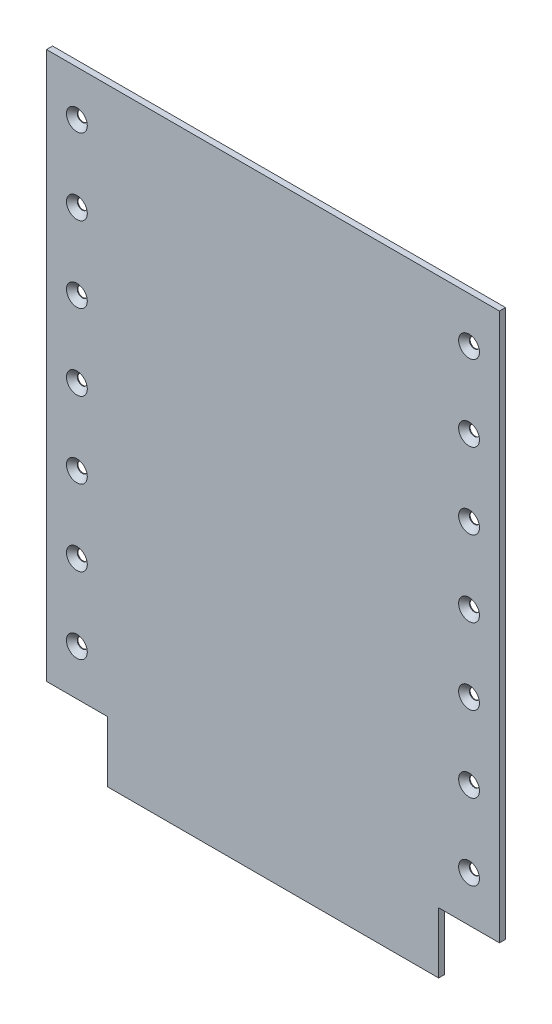
ISO-10303-21;
HEADER;
FILE_DESCRIPTION(('STEP AP214'),'2;1');
FILE_NAME('part.step','',(''),(''),'','','');
FILE_SCHEMA(('AUTOMOTIVE_DESIGN { 1 0 10303 214 1 1 1 1 }'));
ENDSEC;
DATA;
#1=APPLICATION_CONTEXT('core data for automotive mechanical design processes');
#2=APPLICATION_PROTOCOL_DEFINITION('international standard','automotive_design',2000,#1);
#3=PRODUCT_CONTEXT('',#1,'mechanical');
#4=PRODUCT('Part','Part','',(#3));
#5=PRODUCT_RELATED_PRODUCT_CATEGORY('part','',(#4));
#6=PRODUCT_DEFINITION_FORMATION('','',#4);
#7=PRODUCT_DEFINITION_CONTEXT('part definition',#1,'design');
#8=PRODUCT_DEFINITION('design','',#6,#7);
#9=PRODUCT_DEFINITION_SHAPE('','',#8);
#10=(LENGTH_UNIT() NAMED_UNIT(*) SI_UNIT(.MILLI.,.METRE.));
#11=(NAMED_UNIT(*) PLANE_ANGLE_UNIT() SI_UNIT($,.RADIAN.));
#12=(NAMED_UNIT(*) SI_UNIT($,.STERADIAN.) SOLID_ANGLE_UNIT());
#13=UNCERTAINTY_MEASURE_WITH_UNIT(LENGTH_MEASURE(1.E-05),#10,'distance_accuracy_value','');
#14=(GEOMETRIC_REPRESENTATION_CONTEXT(3) GLOBAL_UNCERTAINTY_ASSIGNED_CONTEXT((#13)) GLOBAL_UNIT_ASSIGNED_CONTEXT((#10,
#11,#12)) REPRESENTATION_CONTEXT('',''));
#15=CARTESIAN_POINT('',(0.,0.,0.));
#16=DIRECTION('',(0.,0.,1.));
#17=DIRECTION('',(1.,0.,0.));
#18=AXIS2_PLACEMENT_3D('',#15,#16,#17);
#19=CARTESIAN_POINT('',(0.,40.,4.));
#20=DIRECTION('',(1.,0.,0.));
#21=DIRECTION('',(0.,1.,0.));
#22=AXIS2_PLACEMENT_3D('',#19,#20,#21);
#23=PLANE('',#22);
#24=DIRECTION('',(0.,-1.,0.));
#25=VECTOR('',#24,1.);
#26=CARTESIAN_POINT('',(0.,40.,0.));
#27=LINE('',#26,#25);
#28=CARTESIAN_POINT('',(0.,40.,0.));
#29=VERTEX_POINT('',#28);
#30=CARTESIAN_POINT('',(0.,0.,0.));
#31=VERTEX_POINT('',#30);
#32=EDGE_CURVE('E129',#29,#31,#27,.T.);
#33=ORIENTED_EDGE('',*,*,#32,.T.);
#34=DIRECTION('',(0.,0.,-1.));
#35=VECTOR('',#34,1.);
#36=CARTESIAN_POINT('',(0.,0.,4.));
#37=LINE('',#36,#35);
#38=CARTESIAN_POINT('',(0.,0.,4.));
#39=VERTEX_POINT('',#38);
#40=EDGE_CURVE('E11',#39,#31,#37,.T.);
#41=ORIENTED_EDGE('',*,*,#40,.F.);
#42=DIRECTION('',(0.,-1.,0.));
#43=VECTOR('',#42,1.);
#44=CARTESIAN_POINT('',(0.,40.,4.));
#45=LINE('',#44,#43);
#46=CARTESIAN_POINT('',(0.,40.,4.));
#47=VERTEX_POINT('',#46);
#48=EDGE_CURVE('E145',#47,#39,#45,.T.);
#49=ORIENTED_EDGE('',*,*,#48,.F.);
#50=DIRECTION('',(0.,0.,-1.));
#51=VECTOR('',#50,1.);
#52=CARTESIAN_POINT('',(0.,40.,4.));
#53=LINE('',#52,#51);
#54=EDGE_CURVE('E125',#47,#29,#53,.T.);
#55=ORIENTED_EDGE('',*,*,#54,.T.);
#56=EDGE_LOOP('',(#33,#41,#49,#55));
#57=FACE_BOUND('',#56,.T.);
#58=ADVANCED_FACE('F34',(#57),#23,.F.);
#59=CARTESIAN_POINT('',(0.,0.,4.));
#60=DIRECTION('',(0.,1.,0.));
#61=DIRECTION('',(-1.,0.,0.));
#62=AXIS2_PLACEMENT_3D('',#59,#60,#61);
#63=PLANE('',#62);
#64=DIRECTION('',(1.,0.,0.));
#65=VECTOR('',#64,1.);
#66=CARTESIAN_POINT('',(0.,0.,0.));
#67=LINE('',#66,#65);
#68=CARTESIAN_POINT('',(218.,0.,0.));
#69=VERTEX_POINT('',#68);
#70=EDGE_CURVE('E132',#31,#69,#67,.T.);
#71=ORIENTED_EDGE('',*,*,#70,.T.);
#72=DIRECTION('',(0.,0.,-1.));
#73=VECTOR('',#72,1.);
#74=CARTESIAN_POINT('',(218.,0.,4.));
#75=LINE('',#74,#73);
#76=CARTESIAN_POINT('',(218.,0.,4.));
#77=VERTEX_POINT('',#76);
#78=EDGE_CURVE('E42',#77,#69,#75,.T.);
#79=ORIENTED_EDGE('',*,*,#78,.F.);
#80=DIRECTION('',(1.,0.,0.));
#81=VECTOR('',#80,1.);
#82=CARTESIAN_POINT('',(0.,0.,4.));
#83=LINE('',#82,#81);
#84=EDGE_CURVE('E93',#39,#77,#83,.T.);
#85=ORIENTED_EDGE('',*,*,#84,.F.);
#86=ORIENTED_EDGE('',*,*,#40,.T.);
#87=EDGE_LOOP('',(#71,#79,#85,#86));
#88=FACE_BOUND('',#87,.T.);
#89=ADVANCED_FACE('F353',(#88),#63,.F.);
#90=CARTESIAN_POINT('',(218.,40.,4.));
#91=DIRECTION('',(-1.,0.,0.));
#92=DIRECTION('',(0.,0.,1.));
#93=AXIS2_PLACEMENT_3D('',#90,#91,#92);
#94=PLANE('',#93);
#95=DIRECTION('',(0.,1.,0.));
#96=VECTOR('',#95,1.);
#97=CARTESIAN_POINT('',(218.,40.,0.));
#98=LINE('',#97,#96);
#99=CARTESIAN_POINT('',(218.,40.,0.));
#100=VERTEX_POINT('',#99);
#101=EDGE_CURVE('E135',#69,#100,#98,.T.);
#102=ORIENTED_EDGE('',*,*,#101,.T.);
#103=DIRECTION('',(0.,0.,-1.));
#104=VECTOR('',#103,1.);
#105=CARTESIAN_POINT('',(218.,40.,4.));
#106=LINE('',#105,#104);
#107=CARTESIAN_POINT('',(218.,40.,4.));
#108=VERTEX_POINT('',#107);
#109=EDGE_CURVE('E152',#108,#100,#106,.T.);
#110=ORIENTED_EDGE('',*,*,#109,.F.);
#111=DIRECTION('',(0.,1.,0.));
#112=VECTOR('',#111,1.);
#113=CARTESIAN_POINT('',(218.,40.,4.));
#114=LINE('',#113,#112);
#115=EDGE_CURVE('E160',#77,#108,#114,.T.);
#116=ORIENTED_EDGE('',*,*,#115,.F.);
#117=ORIENTED_EDGE('',*,*,#78,.T.);
#118=EDGE_LOOP('',(#102,#110,#116,#117));
#119=FACE_BOUND('',#118,.T.);
#120=ADVANCED_FACE('F158',(#119),#94,.F.);
#121=CARTESIAN_POINT('',(258.,40.,4.));
#122=DIRECTION('',(0.,1.,0.));
#123=DIRECTION('',(-1.,0.,0.));
#124=AXIS2_PLACEMENT_3D('',#121,#122,#123);
#125=PLANE('',#124);
#126=DIRECTION('',(1.,0.,0.));
#127=VECTOR('',#126,1.);
#128=CARTESIAN_POINT('',(258.,40.,0.));
#129=LINE('',#128,#127);
#130=CARTESIAN_POINT('',(258.,40.,0.));
#131=VERTEX_POINT('',#130);
#132=EDGE_CURVE('E137',#100,#131,#129,.T.);
#133=ORIENTED_EDGE('',*,*,#132,.T.);
#134=DIRECTION('',(0.,0.,-1.));
#135=VECTOR('',#134,1.);
#136=CARTESIAN_POINT('',(258.,40.,4.));
#137=LINE('',#136,#135);
#138=CARTESIAN_POINT('',(258.,40.,4.));
#139=VERTEX_POINT('',#138);
#140=EDGE_CURVE('E149',#139,#131,#137,.T.);
#141=ORIENTED_EDGE('',*,*,#140,.F.);
#142=DIRECTION('',(1.,0.,0.));
#143=VECTOR('',#142,1.);
#144=CARTESIAN_POINT('',(258.,40.,4.));
#145=LINE('',#144,#143);
#146=EDGE_CURVE('E172',#108,#139,#145,.T.);
#147=ORIENTED_EDGE('',*,*,#146,.F.);
#148=ORIENTED_EDGE('',*,*,#109,.T.);
#149=EDGE_LOOP('',(#133,#141,#147,#148));
#150=FACE_BOUND('',#149,.T.);
#151=ADVANCED_FACE('F168',(#150),#125,.F.);
#152=CARTESIAN_POINT('',(258.,400.,4.));
#153=DIRECTION('',(-1.,0.,0.));
#154=DIRECTION('',(0.,-1.,0.));
#155=AXIS2_PLACEMENT_3D('',#152,#153,#154);
#156=PLANE('',#155);
#157=DIRECTION('',(0.,1.,0.));
#158=VECTOR('',#157,1.);
#159=CARTESIAN_POINT('',(258.,400.,0.));
#160=LINE('',#159,#158);
#161=CARTESIAN_POINT('',(258.,400.,0.));
#162=VERTEX_POINT('',#161);
#163=EDGE_CURVE('E139',#131,#162,#160,.T.);
#164=ORIENTED_EDGE('',*,*,#163,.T.);
#165=DIRECTION('',(0.,0.,-1.));
#166=VECTOR('',#165,1.);
#167=CARTESIAN_POINT('',(258.,400.,4.));
#168=LINE('',#167,#166);
#169=CARTESIAN_POINT('',(258.,400.,4.));
#170=VERTEX_POINT('',#169);
#171=EDGE_CURVE('E120',#170,#162,#168,.T.);
#172=ORIENTED_EDGE('',*,*,#171,.F.);
#173=DIRECTION('',(0.,1.,0.));
#174=VECTOR('',#173,1.);
#175=CARTESIAN_POINT('',(258.,400.,4.));
#176=LINE('',#175,#174);
#177=EDGE_CURVE('E112',#139,#170,#176,.T.);
#178=ORIENTED_EDGE('',*,*,#177,.F.);
#179=ORIENTED_EDGE('',*,*,#140,.T.);
#180=EDGE_LOOP('',(#164,#172,#178,#179));
#181=FACE_BOUND('',#180,.T.);
#182=ADVANCED_FACE('F171',(#181),#156,.F.);
#183=CARTESIAN_POINT('',(0.,400.,4.));
#184=DIRECTION('',(0.,-1.,0.));
#185=DIRECTION('',(0.,0.,-1.));
#186=AXIS2_PLACEMENT_3D('',#183,#184,#185);
#187=PLANE('',#186);
#188=DIRECTION('',(-1.,0.,0.));
#189=VECTOR('',#188,1.);
#190=CARTESIAN_POINT('',(0.,400.,0.));
#191=LINE('',#190,#189);
#192=CARTESIAN_POINT('',(-40.,400.,0.));
#193=VERTEX_POINT('',#192);
#194=EDGE_CURVE('E119',#162,#193,#191,.T.);
#195=ORIENTED_EDGE('',*,*,#194,.T.);
#196=DIRECTION('',(0.,0.,-1.));
#197=VECTOR('',#196,1.);
#198=CARTESIAN_POINT('',(-40.,400.,4.));
#199=LINE('',#198,#197);
#200=CARTESIAN_POINT('',(-40.,400.,4.));
#201=VERTEX_POINT('',#200);
#202=EDGE_CURVE('E117',#201,#193,#199,.T.);
#203=ORIENTED_EDGE('',*,*,#202,.F.);
#204=DIRECTION('',(-1.,0.,0.));
#205=VECTOR('',#204,1.);
#206=CARTESIAN_POINT('',(218.,400.,4.));
#207=LINE('',#206,#205);
#208=EDGE_CURVE('E106',#170,#201,#207,.T.);
#209=ORIENTED_EDGE('',*,*,#208,.F.);
#210=ORIENTED_EDGE('',*,*,#171,.T.);
#211=EDGE_LOOP('',(#195,#203,#209,#210));
#212=FACE_BOUND('',#211,.T.);
#213=ADVANCED_FACE('F118',(#212),#187,.F.);
#214=CARTESIAN_POINT('',(-40.,400.,4.));
#215=DIRECTION('',(1.,0.,0.));
#216=DIRECTION('',(0.,1.,0.));
#217=AXIS2_PLACEMENT_3D('',#214,#215,#216);
#218=PLANE('',#217);
#219=DIRECTION('',(0.,-1.,0.));
#220=VECTOR('',#219,1.);
#221=CARTESIAN_POINT('',(-40.,400.,0.));
#222=LINE('',#221,#220);
#223=CARTESIAN_POINT('',(-40.,40.,0.));
#224=VERTEX_POINT('',#223);
#225=EDGE_CURVE('E79',#193,#224,#222,.T.);
#226=ORIENTED_EDGE('',*,*,#225,.T.);
#227=DIRECTION('',(0.,0.,-1.));
#228=VECTOR('',#227,1.);
#229=CARTESIAN_POINT('',(-40.,40.,4.));
#230=LINE('',#229,#228);
#231=CARTESIAN_POINT('',(-40.,40.,4.));
#232=VERTEX_POINT('',#231);
#233=EDGE_CURVE('E121',#232,#224,#230,.T.);
#234=ORIENTED_EDGE('',*,*,#233,.F.);
#235=DIRECTION('',(0.,-1.,0.));
#236=VECTOR('',#235,1.);
#237=CARTESIAN_POINT('',(-40.,400.,4.));
#238=LINE('',#237,#236);
#239=EDGE_CURVE('E110',#201,#232,#238,.T.);
#240=ORIENTED_EDGE('',*,*,#239,.F.);
#241=ORIENTED_EDGE('',*,*,#202,.T.);
#242=EDGE_LOOP('',(#226,#234,#240,#241));
#243=FACE_BOUND('',#242,.T.);
#244=ADVANCED_FACE('F123',(#243),#218,.F.);
#245=CARTESIAN_POINT('',(-40.,40.,4.));
#246=DIRECTION('',(0.,1.,0.));
#247=DIRECTION('',(0.,0.,1.));
#248=AXIS2_PLACEMENT_3D('',#245,#246,#247);
#249=PLANE('',#248);
#250=DIRECTION('',(1.,0.,0.));
#251=VECTOR('',#250,1.);
#252=CARTESIAN_POINT('',(-40.,40.,0.));
#253=LINE('',#252,#251);
#254=EDGE_CURVE('E85',#224,#29,#253,.T.);
#255=ORIENTED_EDGE('',*,*,#254,.T.);
#256=ORIENTED_EDGE('',*,*,#54,.F.);
#257=DIRECTION('',(1.,0.,0.));
#258=VECTOR('',#257,1.);
#259=CARTESIAN_POINT('',(-40.,40.,4.));
#260=LINE('',#259,#258);
#261=EDGE_CURVE('E50',#232,#47,#260,.T.);
#262=ORIENTED_EDGE('',*,*,#261,.F.);
#263=ORIENTED_EDGE('',*,*,#233,.T.);
#264=EDGE_LOOP('',(#255,#256,#262,#263));
#265=FACE_BOUND('',#264,.T.);
#266=ADVANCED_FACE('F308',(#265),#249,.F.);
#267=CARTESIAN_POINT('',(0.,0.,4.));
#268=DIRECTION('',(0.,0.,1.));
#269=DIRECTION('',(1.,0.,0.));
#270=AXIS2_PLACEMENT_3D('',#267,#268,#269);
#271=PLANE('',#270);
#272=CARTESIAN_POINT('',(238.,70.0000000000001,4.));
#273=DIRECTION('',(0.,0.,1.));
#274=DIRECTION('',(1.,0.,0.));
#275=AXIS2_PLACEMENT_3D('',#272,#273,#274);
#276=CIRCLE('',#275,6.855);
#277=CARTESIAN_POINT('',(244.855,70.0000000000001,4.));
#278=VERTEX_POINT('',#277);
#279=EDGE_CURVE('E300',#278,#278,#276,.T.);
#280=ORIENTED_EDGE('',*,*,#279,.F.);
#281=EDGE_LOOP('',(#280));
#282=FACE_BOUND('',#281,.T.);
#283=CARTESIAN_POINT('',(-20.,70.0000000000001,4.));
#284=DIRECTION('',(0.,0.,1.));
#285=DIRECTION('',(1.,0.,0.));
#286=AXIS2_PLACEMENT_3D('',#283,#284,#285);
#287=CIRCLE('',#286,6.855);
#288=CARTESIAN_POINT('',(-13.145,70.0000000000001,4.));
#289=VERTEX_POINT('',#288);
#290=EDGE_CURVE('E291',#289,#289,#287,.T.);
#291=ORIENTED_EDGE('',*,*,#290,.F.);
#292=EDGE_LOOP('',(#291));
#293=FACE_BOUND('',#292,.T.);
#294=CARTESIAN_POINT('',(238.,120.,4.));
#295=DIRECTION('',(0.,0.,1.));
#296=DIRECTION('',(1.,0.,0.));
#297=AXIS2_PLACEMENT_3D('',#294,#295,#296);
#298=CIRCLE('',#297,6.855);
#299=CARTESIAN_POINT('',(244.855,120.,4.));
#300=VERTEX_POINT('',#299);
#301=EDGE_CURVE('E282',#300,#300,#298,.T.);
#302=ORIENTED_EDGE('',*,*,#301,.F.);
#303=EDGE_LOOP('',(#302));
#304=FACE_BOUND('',#303,.T.);
#305=CARTESIAN_POINT('',(-20.0000000000002,120.,4.));
#306=DIRECTION('',(0.,0.,1.));
#307=DIRECTION('',(1.,0.,0.));
#308=AXIS2_PLACEMENT_3D('',#305,#306,#307);
#309=CIRCLE('',#308,6.855);
#310=CARTESIAN_POINT('',(-13.1450000000002,120.,4.));
#311=VERTEX_POINT('',#310);
#312=EDGE_CURVE('E273',#311,#311,#309,.T.);
#313=ORIENTED_EDGE('',*,*,#312,.F.);
#314=EDGE_LOOP('',(#313));
#315=FACE_BOUND('',#314,.T.);
#316=CARTESIAN_POINT('',(238.,170.,4.));
#317=DIRECTION('',(0.,0.,1.));
#318=DIRECTION('',(1.,0.,0.));
#319=AXIS2_PLACEMENT_3D('',#316,#317,#318);
#320=CIRCLE('',#319,6.855);
#321=CARTESIAN_POINT('',(244.855,170.,4.));
#322=VERTEX_POINT('',#321);
#323=EDGE_CURVE('E264',#322,#322,#320,.T.);
#324=ORIENTED_EDGE('',*,*,#323,.F.);
#325=EDGE_LOOP('',(#324));
#326=FACE_BOUND('',#325,.T.);
#327=CARTESIAN_POINT('',(-20.0000000000004,170.,4.));
#328=DIRECTION('',(0.,0.,1.));
#329=DIRECTION('',(1.,0.,0.));
#330=AXIS2_PLACEMENT_3D('',#327,#328,#329);
#331=CIRCLE('',#330,6.855);
#332=CARTESIAN_POINT('',(-13.1450000000004,170.,4.));
#333=VERTEX_POINT('',#332);
#334=EDGE_CURVE('E255',#333,#333,#331,.T.);
#335=ORIENTED_EDGE('',*,*,#334,.F.);
#336=EDGE_LOOP('',(#335));
#337=FACE_BOUND('',#336,.T.);
#338=CARTESIAN_POINT('',(238.,220.,4.));
#339=DIRECTION('',(0.,0.,1.));
#340=DIRECTION('',(1.,0.,0.));
#341=AXIS2_PLACEMENT_3D('',#338,#339,#340);
#342=CIRCLE('',#341,6.855);
#343=CARTESIAN_POINT('',(244.855,220.,4.));
#344=VERTEX_POINT('',#343);
#345=EDGE_CURVE('E246',#344,#344,#342,.T.);
#346=ORIENTED_EDGE('',*,*,#345,.F.);
#347=EDGE_LOOP('',(#346));
#348=FACE_BOUND('',#347,.T.);
#349=CARTESIAN_POINT('',(-20.0000000000006,220.,4.));
#350=DIRECTION('',(0.,0.,1.));
#351=DIRECTION('',(1.,0.,0.));
#352=AXIS2_PLACEMENT_3D('',#349,#350,#351);
#353=CIRCLE('',#352,6.855);
#354=CARTESIAN_POINT('',(-13.1450000000006,220.,4.));
#355=VERTEX_POINT('',#354);
#356=EDGE_CURVE('E237',#355,#355,#353,.T.);
#357=ORIENTED_EDGE('',*,*,#356,.F.);
#358=EDGE_LOOP('',(#357));
#359=FACE_BOUND('',#358,.T.);
#360=CARTESIAN_POINT('',(237.999999999999,270.,4.));
#361=DIRECTION('',(0.,0.,1.));
#362=DIRECTION('',(1.,0.,0.));
#363=AXIS2_PLACEMENT_3D('',#360,#361,#362);
#364=CIRCLE('',#363,6.855);
#365=CARTESIAN_POINT('',(244.854999999999,270.,4.));
#366=VERTEX_POINT('',#365);
#367=EDGE_CURVE('E228',#366,#366,#364,.T.);
#368=ORIENTED_EDGE('',*,*,#367,.F.);
#369=EDGE_LOOP('',(#368));
#370=FACE_BOUND('',#369,.T.);
#371=CARTESIAN_POINT('',(-20.0000000000008,270.,4.));
#372=DIRECTION('',(0.,0.,1.));
#373=DIRECTION('',(1.,0.,0.));
#374=AXIS2_PLACEMENT_3D('',#371,#372,#373);
#375=CIRCLE('',#374,6.855);
#376=CARTESIAN_POINT('',(-13.1450000000008,270.,4.));
#377=VERTEX_POINT('',#376);
#378=EDGE_CURVE('E219',#377,#377,#375,.T.);
#379=ORIENTED_EDGE('',*,*,#378,.F.);
#380=EDGE_LOOP('',(#379));
#381=FACE_BOUND('',#380,.T.);
#382=CARTESIAN_POINT('',(237.999999999999,320.,4.));
#383=DIRECTION('',(0.,0.,1.));
#384=DIRECTION('',(1.,0.,0.));
#385=AXIS2_PLACEMENT_3D('',#382,#383,#384);
#386=CIRCLE('',#385,6.855);
#387=CARTESIAN_POINT('',(244.854999999999,320.,4.));
#388=VERTEX_POINT('',#387);
#389=EDGE_CURVE('E210',#388,#388,#386,.T.);
#390=ORIENTED_EDGE('',*,*,#389,.F.);
#391=EDGE_LOOP('',(#390));
#392=FACE_BOUND('',#391,.T.);
#393=CARTESIAN_POINT('',(-20.0000000000009,320.,4.));
#394=DIRECTION('',(0.,0.,1.));
#395=DIRECTION('',(1.,0.,0.));
#396=AXIS2_PLACEMENT_3D('',#393,#394,#395);
#397=CIRCLE('',#396,6.855);
#398=CARTESIAN_POINT('',(-13.1450000000009,320.,4.));
#399=VERTEX_POINT('',#398);
#400=EDGE_CURVE('E201',#399,#399,#397,.T.);
#401=ORIENTED_EDGE('',*,*,#400,.F.);
#402=EDGE_LOOP('',(#401));
#403=FACE_BOUND('',#402,.T.);
#404=CARTESIAN_POINT('',(237.999999999999,370.,4.));
#405=DIRECTION('',(0.,0.,1.));
#406=DIRECTION('',(1.,0.,0.));
#407=AXIS2_PLACEMENT_3D('',#404,#405,#406);
#408=CIRCLE('',#407,6.855);
#409=CARTESIAN_POINT('',(244.854999999999,370.,4.));
#410=VERTEX_POINT('',#409);
#411=EDGE_CURVE('E192',#410,#410,#408,.T.);
#412=ORIENTED_EDGE('',*,*,#411,.F.);
#413=EDGE_LOOP('',(#412));
#414=FACE_BOUND('',#413,.T.);
#415=CARTESIAN_POINT('',(-20.0000000000011,370.,4.));
#416=DIRECTION('',(0.,0.,1.));
#417=DIRECTION('',(1.,0.,0.));
#418=AXIS2_PLACEMENT_3D('',#415,#416,#417);
#419=CIRCLE('',#418,6.855);
#420=CARTESIAN_POINT('',(-13.1450000000011,370.,4.));
#421=VERTEX_POINT('',#420);
#422=EDGE_CURVE('E183',#421,#421,#419,.T.);
#423=ORIENTED_EDGE('',*,*,#422,.F.);
#424=EDGE_LOOP('',(#423));
#425=FACE_BOUND('',#424,.T.);
#426=ORIENTED_EDGE('',*,*,#48,.T.);
#427=ORIENTED_EDGE('',*,*,#84,.T.);
#428=ORIENTED_EDGE('',*,*,#115,.T.);
#429=ORIENTED_EDGE('',*,*,#146,.T.);
#430=ORIENTED_EDGE('',*,*,#177,.T.);
#431=ORIENTED_EDGE('',*,*,#208,.T.);
#432=ORIENTED_EDGE('',*,*,#239,.T.);
#433=ORIENTED_EDGE('',*,*,#261,.T.);
#434=EDGE_LOOP('',(#426,#427,#428,#429,#430,#431,#432,#433));
#435=FACE_BOUND('',#434,.T.);
#436=ADVANCED_FACE('F108',(#282,#293,#304,#315,#326,#337,#348,#359,#370,#381,#392,#403,#414,
#425,#435),#271,.T.);
#437=CARTESIAN_POINT('',(0.,0.,0.));
#438=DIRECTION('',(0.,0.,1.));
#439=DIRECTION('',(1.,0.,0.));
#440=AXIS2_PLACEMENT_3D('',#437,#438,#439);
#441=PLANE('',#440);
#442=CARTESIAN_POINT('',(238.,70.0000000000001,0.));
#443=DIRECTION('',(0.,0.,1.));
#444=DIRECTION('',(1.,0.,0.));
#445=AXIS2_PLACEMENT_3D('',#442,#443,#444);
#446=CIRCLE('',#445,3.3);
#447=CARTESIAN_POINT('',(241.3,70.0000000000001,0.));
#448=VERTEX_POINT('',#447);
#449=EDGE_CURVE('E294',#448,#448,#446,.T.);
#450=ORIENTED_EDGE('',*,*,#449,.T.);
#451=EDGE_LOOP('',(#450));
#452=FACE_BOUND('',#451,.T.);
#453=CARTESIAN_POINT('',(-20.,70.0000000000001,0.));
#454=DIRECTION('',(0.,0.,1.));
#455=DIRECTION('',(1.,0.,0.));
#456=AXIS2_PLACEMENT_3D('',#453,#454,#455);
#457=CIRCLE('',#456,3.3);
#458=CARTESIAN_POINT('',(-16.7,70.0000000000001,0.));
#459=VERTEX_POINT('',#458);
#460=EDGE_CURVE('E285',#459,#459,#457,.T.);
#461=ORIENTED_EDGE('',*,*,#460,.T.);
#462=EDGE_LOOP('',(#461));
#463=FACE_BOUND('',#462,.T.);
#464=CARTESIAN_POINT('',(238.,120.,0.));
#465=DIRECTION('',(0.,0.,1.));
#466=DIRECTION('',(1.,0.,0.));
#467=AXIS2_PLACEMENT_3D('',#464,#465,#466);
#468=CIRCLE('',#467,3.3);
#469=CARTESIAN_POINT('',(241.3,120.,0.));
#470=VERTEX_POINT('',#469);
#471=EDGE_CURVE('E276',#470,#470,#468,.T.);
#472=ORIENTED_EDGE('',*,*,#471,.T.);
#473=EDGE_LOOP('',(#472));
#474=FACE_BOUND('',#473,.T.);
#475=CARTESIAN_POINT('',(-20.0000000000002,120.,0.));
#476=DIRECTION('',(0.,0.,1.));
#477=DIRECTION('',(1.,0.,0.));
#478=AXIS2_PLACEMENT_3D('',#475,#476,#477);
#479=CIRCLE('',#478,3.3);
#480=CARTESIAN_POINT('',(-16.7000000000002,120.,0.));
#481=VERTEX_POINT('',#480);
#482=EDGE_CURVE('E267',#481,#481,#479,.T.);
#483=ORIENTED_EDGE('',*,*,#482,.T.);
#484=EDGE_LOOP('',(#483));
#485=FACE_BOUND('',#484,.T.);
#486=CARTESIAN_POINT('',(238.,170.,0.));
#487=DIRECTION('',(0.,0.,1.));
#488=DIRECTION('',(1.,0.,0.));
#489=AXIS2_PLACEMENT_3D('',#486,#487,#488);
#490=CIRCLE('',#489,3.3);
#491=CARTESIAN_POINT('',(241.3,170.,0.));
#492=VERTEX_POINT('',#491);
#493=EDGE_CURVE('E258',#492,#492,#490,.T.);
#494=ORIENTED_EDGE('',*,*,#493,.T.);
#495=EDGE_LOOP('',(#494));
#496=FACE_BOUND('',#495,.T.);
#497=CARTESIAN_POINT('',(-20.0000000000004,170.,0.));
#498=DIRECTION('',(0.,0.,1.));
#499=DIRECTION('',(1.,0.,0.));
#500=AXIS2_PLACEMENT_3D('',#497,#498,#499);
#501=CIRCLE('',#500,3.3);
#502=CARTESIAN_POINT('',(-16.7000000000004,170.,0.));
#503=VERTEX_POINT('',#502);
#504=EDGE_CURVE('E249',#503,#503,#501,.T.);
#505=ORIENTED_EDGE('',*,*,#504,.T.);
#506=EDGE_LOOP('',(#505));
#507=FACE_BOUND('',#506,.T.);
#508=CARTESIAN_POINT('',(238.,220.,0.));
#509=DIRECTION('',(0.,0.,1.));
#510=DIRECTION('',(1.,0.,0.));
#511=AXIS2_PLACEMENT_3D('',#508,#509,#510);
#512=CIRCLE('',#511,3.3);
#513=CARTESIAN_POINT('',(241.3,220.,0.));
#514=VERTEX_POINT('',#513);
#515=EDGE_CURVE('E240',#514,#514,#512,.T.);
#516=ORIENTED_EDGE('',*,*,#515,.T.);
#517=EDGE_LOOP('',(#516));
#518=FACE_BOUND('',#517,.T.);
#519=CARTESIAN_POINT('',(-20.0000000000006,220.,0.));
#520=DIRECTION('',(0.,0.,1.));
#521=DIRECTION('',(1.,0.,0.));
#522=AXIS2_PLACEMENT_3D('',#519,#520,#521);
#523=CIRCLE('',#522,3.3);
#524=CARTESIAN_POINT('',(-16.7000000000006,220.,0.));
#525=VERTEX_POINT('',#524);
#526=EDGE_CURVE('E231',#525,#525,#523,.T.);
#527=ORIENTED_EDGE('',*,*,#526,.T.);
#528=EDGE_LOOP('',(#527));
#529=FACE_BOUND('',#528,.T.);
#530=CARTESIAN_POINT('',(237.999999999999,270.,0.));
#531=DIRECTION('',(0.,0.,1.));
#532=DIRECTION('',(1.,0.,0.));
#533=AXIS2_PLACEMENT_3D('',#530,#531,#532);
#534=CIRCLE('',#533,3.3);
#535=CARTESIAN_POINT('',(241.299999999999,270.,0.));
#536=VERTEX_POINT('',#535);
#537=EDGE_CURVE('E222',#536,#536,#534,.T.);
#538=ORIENTED_EDGE('',*,*,#537,.T.);
#539=EDGE_LOOP('',(#538));
#540=FACE_BOUND('',#539,.T.);
#541=CARTESIAN_POINT('',(-20.0000000000008,270.,0.));
#542=DIRECTION('',(0.,0.,1.));
#543=DIRECTION('',(1.,0.,0.));
#544=AXIS2_PLACEMENT_3D('',#541,#542,#543);
#545=CIRCLE('',#544,3.3);
#546=CARTESIAN_POINT('',(-16.7000000000008,270.,0.));
#547=VERTEX_POINT('',#546);
#548=EDGE_CURVE('E213',#547,#547,#545,.T.);
#549=ORIENTED_EDGE('',*,*,#548,.T.);
#550=EDGE_LOOP('',(#549));
#551=FACE_BOUND('',#550,.T.);
#552=CARTESIAN_POINT('',(237.999999999999,320.,0.));
#553=DIRECTION('',(0.,0.,1.));
#554=DIRECTION('',(1.,0.,0.));
#555=AXIS2_PLACEMENT_3D('',#552,#553,#554);
#556=CIRCLE('',#555,3.3);
#557=CARTESIAN_POINT('',(241.299999999999,320.,0.));
#558=VERTEX_POINT('',#557);
#559=EDGE_CURVE('E204',#558,#558,#556,.T.);
#560=ORIENTED_EDGE('',*,*,#559,.T.);
#561=EDGE_LOOP('',(#560));
#562=FACE_BOUND('',#561,.T.);
#563=CARTESIAN_POINT('',(-20.0000000000009,320.,0.));
#564=DIRECTION('',(0.,0.,1.));
#565=DIRECTION('',(1.,0.,0.));
#566=AXIS2_PLACEMENT_3D('',#563,#564,#565);
#567=CIRCLE('',#566,3.3);
#568=CARTESIAN_POINT('',(-16.7000000000009,320.,0.));
#569=VERTEX_POINT('',#568);
#570=EDGE_CURVE('E195',#569,#569,#567,.T.);
#571=ORIENTED_EDGE('',*,*,#570,.T.);
#572=EDGE_LOOP('',(#571));
#573=FACE_BOUND('',#572,.T.);
#574=CARTESIAN_POINT('',(237.999999999999,370.,0.));
#575=DIRECTION('',(0.,0.,1.));
#576=DIRECTION('',(1.,0.,0.));
#577=AXIS2_PLACEMENT_3D('',#574,#575,#576);
#578=CIRCLE('',#577,3.3);
#579=CARTESIAN_POINT('',(241.299999999999,370.,0.));
#580=VERTEX_POINT('',#579);
#581=EDGE_CURVE('E186',#580,#580,#578,.T.);
#582=ORIENTED_EDGE('',*,*,#581,.T.);
#583=EDGE_LOOP('',(#582));
#584=FACE_BOUND('',#583,.T.);
#585=CARTESIAN_POINT('',(-20.0000000000011,370.,0.));
#586=DIRECTION('',(0.,0.,1.));
#587=DIRECTION('',(1.,0.,0.));
#588=AXIS2_PLACEMENT_3D('',#585,#586,#587);
#589=CIRCLE('',#588,3.3);
#590=CARTESIAN_POINT('',(-16.7000000000011,370.,0.));
#591=VERTEX_POINT('',#590);
#592=EDGE_CURVE('E133',#591,#591,#589,.T.);
#593=ORIENTED_EDGE('',*,*,#592,.T.);
#594=EDGE_LOOP('',(#593));
#595=FACE_BOUND('',#594,.T.);
#596=ORIENTED_EDGE('',*,*,#32,.F.);
#597=ORIENTED_EDGE('',*,*,#254,.F.);
#598=ORIENTED_EDGE('',*,*,#225,.F.);
#599=ORIENTED_EDGE('',*,*,#194,.F.);
#600=ORIENTED_EDGE('',*,*,#163,.F.);
#601=ORIENTED_EDGE('',*,*,#132,.F.);
#602=ORIENTED_EDGE('',*,*,#101,.F.);
#603=ORIENTED_EDGE('',*,*,#70,.F.);
#604=EDGE_LOOP('',(#596,#597,#598,#599,#600,#601,#602,#603));
#605=FACE_BOUND('',#604,.T.);
#606=ADVANCED_FACE('F164',(#452,#463,#474,#485,#496,#507,#518,#529,#540,#551,#562,#573,#584,
#595,#605),#441,.F.);
#607=CARTESIAN_POINT('',(-20.0000000000011,370.,4.));
#608=DIRECTION('',(0.,0.,1.));
#609=DIRECTION('',(1.,0.,0.));
#610=AXIS2_PLACEMENT_3D('',#607,#608,#609);
#611=CYLINDRICAL_SURFACE('',#610,3.3);
#612=ORIENTED_EDGE('',*,*,#592,.F.);
#613=EDGE_LOOP('',(#612));
#614=FACE_BOUND('',#613,.T.);
#615=CARTESIAN_POINT('',(-20.0000000000011,370.,0.445000000000001));
#616=DIRECTION('',(0.,0.,1.));
#617=DIRECTION('',(1.,0.,0.));
#618=AXIS2_PLACEMENT_3D('',#615,#616,#617);
#619=CIRCLE('',#618,3.3);
#620=CARTESIAN_POINT('',(-16.7000000000011,370.,0.445000000000001));
#621=VERTEX_POINT('',#620);
#622=EDGE_CURVE('E180',#621,#621,#619,.T.);
#623=ORIENTED_EDGE('',*,*,#622,.T.);
#624=EDGE_LOOP('',(#623));
#625=FACE_BOUND('',#624,.T.);
#626=ADVANCED_FACE('F339',(#614,#625),#611,.F.);
#627=CARTESIAN_POINT('',(-20.0000000000011,370.,4.));
#628=DIRECTION('',(0.,0.,1.));
#629=DIRECTION('',(1.,0.,0.));
#630=AXIS2_PLACEMENT_3D('',#627,#628,#629);
#631=CONICAL_SURFACE('',#630,6.855,0.785398163397449);
#632=ORIENTED_EDGE('',*,*,#622,.F.);
#633=EDGE_LOOP('',(#632));
#634=FACE_BOUND('',#633,.T.);
#635=ORIENTED_EDGE('',*,*,#422,.T.);
#636=EDGE_LOOP('',(#635));
#637=FACE_BOUND('',#636,.T.);
#638=ADVANCED_FACE('F336',(#634,#637),#631,.F.);
#639=CARTESIAN_POINT('',(237.999999999999,370.,4.));
#640=DIRECTION('',(0.,0.,1.));
#641=DIRECTION('',(1.,0.,0.));
#642=AXIS2_PLACEMENT_3D('',#639,#640,#641);
#643=CYLINDRICAL_SURFACE('',#642,3.3);
#644=ORIENTED_EDGE('',*,*,#581,.F.);
#645=EDGE_LOOP('',(#644));
#646=FACE_BOUND('',#645,.T.);
#647=CARTESIAN_POINT('',(237.999999999999,370.,0.445000000000001));
#648=DIRECTION('',(0.,0.,1.));
#649=DIRECTION('',(1.,0.,0.));
#650=AXIS2_PLACEMENT_3D('',#647,#648,#649);
#651=CIRCLE('',#650,3.3);
#652=CARTESIAN_POINT('',(241.299999999999,370.,0.445000000000001));
#653=VERTEX_POINT('',#652);
#654=EDGE_CURVE('E189',#653,#653,#651,.T.);
#655=ORIENTED_EDGE('',*,*,#654,.T.);
#656=EDGE_LOOP('',(#655));
#657=FACE_BOUND('',#656,.T.);
#658=ADVANCED_FACE('F338',(#646,#657),#643,.F.);
#659=CARTESIAN_POINT('',(237.999999999999,370.,4.));
#660=DIRECTION('',(0.,0.,1.));
#661=DIRECTION('',(1.,0.,0.));
#662=AXIS2_PLACEMENT_3D('',#659,#660,#661);
#663=CONICAL_SURFACE('',#662,6.855,0.785398163397449);
#664=ORIENTED_EDGE('',*,*,#654,.F.);
#665=EDGE_LOOP('',(#664));
#666=FACE_BOUND('',#665,.T.);
#667=ORIENTED_EDGE('',*,*,#411,.T.);
#668=EDGE_LOOP('',(#667));
#669=FACE_BOUND('',#668,.T.);
#670=ADVANCED_FACE('F346',(#666,#669),#663,.F.);
#671=CARTESIAN_POINT('',(-20.0000000000009,320.,4.));
#672=DIRECTION('',(0.,0.,1.));
#673=DIRECTION('',(1.,0.,0.));
#674=AXIS2_PLACEMENT_3D('',#671,#672,#673);
#675=CYLINDRICAL_SURFACE('',#674,3.3);
#676=ORIENTED_EDGE('',*,*,#570,.F.);
#677=EDGE_LOOP('',(#676));
#678=FACE_BOUND('',#677,.T.);
#679=CARTESIAN_POINT('',(-20.0000000000009,320.,0.445000000000001));
#680=DIRECTION('',(0.,0.,1.));
#681=DIRECTION('',(1.,0.,0.));
#682=AXIS2_PLACEMENT_3D('',#679,#680,#681);
#683=CIRCLE('',#682,3.3);
#684=CARTESIAN_POINT('',(-16.7000000000009,320.,0.445000000000001));
#685=VERTEX_POINT('',#684);
#686=EDGE_CURVE('E198',#685,#685,#683,.T.);
#687=ORIENTED_EDGE('',*,*,#686,.T.);
#688=EDGE_LOOP('',(#687));
#689=FACE_BOUND('',#688,.T.);
#690=ADVANCED_FACE('F438',(#678,#689),#675,.F.);
#691=CARTESIAN_POINT('',(-20.0000000000009,320.,4.));
#692=DIRECTION('',(0.,0.,1.));
#693=DIRECTION('',(1.,0.,0.));
#694=AXIS2_PLACEMENT_3D('',#691,#692,#693);
#695=CONICAL_SURFACE('',#694,6.855,0.785398163397449);
#696=ORIENTED_EDGE('',*,*,#686,.F.);
#697=EDGE_LOOP('',(#696));
#698=FACE_BOUND('',#697,.T.);
#699=ORIENTED_EDGE('',*,*,#400,.T.);
#700=EDGE_LOOP('',(#699));
#701=FACE_BOUND('',#700,.T.);
#702=ADVANCED_FACE('F448',(#698,#701),#695,.F.);
#703=CARTESIAN_POINT('',(237.999999999999,320.,4.));
#704=DIRECTION('',(0.,0.,1.));
#705=DIRECTION('',(1.,0.,0.));
#706=AXIS2_PLACEMENT_3D('',#703,#704,#705);
#707=CYLINDRICAL_SURFACE('',#706,3.3);
#708=ORIENTED_EDGE('',*,*,#559,.F.);
#709=EDGE_LOOP('',(#708));
#710=FACE_BOUND('',#709,.T.);
#711=CARTESIAN_POINT('',(237.999999999999,320.,0.445000000000001));
#712=DIRECTION('',(0.,0.,1.));
#713=DIRECTION('',(1.,0.,0.));
#714=AXIS2_PLACEMENT_3D('',#711,#712,#713);
#715=CIRCLE('',#714,3.3);
#716=CARTESIAN_POINT('',(241.299999999999,320.,0.445000000000001));
#717=VERTEX_POINT('',#716);
#718=EDGE_CURVE('E207',#717,#717,#715,.T.);
#719=ORIENTED_EDGE('',*,*,#718,.T.);
#720=EDGE_LOOP('',(#719));
#721=FACE_BOUND('',#720,.T.);
#722=ADVANCED_FACE('F458',(#710,#721),#707,.F.);
#723=CARTESIAN_POINT('',(237.999999999999,320.,4.));
#724=DIRECTION('',(0.,0.,1.));
#725=DIRECTION('',(1.,0.,0.));
#726=AXIS2_PLACEMENT_3D('',#723,#724,#725);
#727=CONICAL_SURFACE('',#726,6.855,0.785398163397449);
#728=ORIENTED_EDGE('',*,*,#718,.F.);
#729=EDGE_LOOP('',(#728));
#730=FACE_BOUND('',#729,.T.);
#731=ORIENTED_EDGE('',*,*,#389,.T.);
#732=EDGE_LOOP('',(#731));
#733=FACE_BOUND('',#732,.T.);
#734=ADVANCED_FACE('F468',(#730,#733),#727,.F.);
#735=CARTESIAN_POINT('',(-20.0000000000008,270.,4.));
#736=DIRECTION('',(0.,0.,1.));
#737=DIRECTION('',(1.,0.,0.));
#738=AXIS2_PLACEMENT_3D('',#735,#736,#737);
#739=CYLINDRICAL_SURFACE('',#738,3.3);
#740=ORIENTED_EDGE('',*,*,#548,.F.);
#741=EDGE_LOOP('',(#740));
#742=FACE_BOUND('',#741,.T.);
#743=CARTESIAN_POINT('',(-20.0000000000008,270.,0.445000000000001));
#744=DIRECTION('',(0.,0.,1.));
#745=DIRECTION('',(1.,0.,0.));
#746=AXIS2_PLACEMENT_3D('',#743,#744,#745);
#747=CIRCLE('',#746,3.3);
#748=CARTESIAN_POINT('',(-16.7000000000008,270.,0.445000000000001));
#749=VERTEX_POINT('',#748);
#750=EDGE_CURVE('E216',#749,#749,#747,.T.);
#751=ORIENTED_EDGE('',*,*,#750,.T.);
#752=EDGE_LOOP('',(#751));
#753=FACE_BOUND('',#752,.T.);
#754=ADVANCED_FACE('F478',(#742,#753),#739,.F.);
#755=CARTESIAN_POINT('',(-20.0000000000008,270.,4.));
#756=DIRECTION('',(0.,0.,1.));
#757=DIRECTION('',(1.,0.,0.));
#758=AXIS2_PLACEMENT_3D('',#755,#756,#757);
#759=CONICAL_SURFACE('',#758,6.855,0.785398163397448);
#760=ORIENTED_EDGE('',*,*,#750,.F.);
#761=EDGE_LOOP('',(#760));
#762=FACE_BOUND('',#761,.T.);
#763=ORIENTED_EDGE('',*,*,#378,.T.);
#764=EDGE_LOOP('',(#763));
#765=FACE_BOUND('',#764,.T.);
#766=ADVANCED_FACE('F488',(#762,#765),#759,.F.);
#767=CARTESIAN_POINT('',(237.999999999999,270.,4.));
#768=DIRECTION('',(0.,0.,1.));
#769=DIRECTION('',(1.,0.,0.));
#770=AXIS2_PLACEMENT_3D('',#767,#768,#769);
#771=CYLINDRICAL_SURFACE('',#770,3.3);
#772=ORIENTED_EDGE('',*,*,#537,.F.);
#773=EDGE_LOOP('',(#772));
#774=FACE_BOUND('',#773,.T.);
#775=CARTESIAN_POINT('',(237.999999999999,270.,0.445000000000001));
#776=DIRECTION('',(0.,0.,1.));
#777=DIRECTION('',(1.,0.,0.));
#778=AXIS2_PLACEMENT_3D('',#775,#776,#777);
#779=CIRCLE('',#778,3.3);
#780=CARTESIAN_POINT('',(241.299999999999,270.,0.445000000000001));
#781=VERTEX_POINT('',#780);
#782=EDGE_CURVE('E225',#781,#781,#779,.T.);
#783=ORIENTED_EDGE('',*,*,#782,.T.);
#784=EDGE_LOOP('',(#783));
#785=FACE_BOUND('',#784,.T.);
#786=ADVANCED_FACE('F498',(#774,#785),#771,.F.);
#787=CARTESIAN_POINT('',(237.999999999999,270.,4.));
#788=DIRECTION('',(0.,0.,1.));
#789=DIRECTION('',(1.,0.,0.));
#790=AXIS2_PLACEMENT_3D('',#787,#788,#789);
#791=CONICAL_SURFACE('',#790,6.855,0.785398163397449);
#792=ORIENTED_EDGE('',*,*,#782,.F.);
#793=EDGE_LOOP('',(#792));
#794=FACE_BOUND('',#793,.T.);
#795=ORIENTED_EDGE('',*,*,#367,.T.);
#796=EDGE_LOOP('',(#795));
#797=FACE_BOUND('',#796,.T.);
#798=ADVANCED_FACE('F508',(#794,#797),#791,.F.);
#799=CARTESIAN_POINT('',(-20.0000000000006,220.,4.));
#800=DIRECTION('',(0.,0.,1.));
#801=DIRECTION('',(1.,0.,0.));
#802=AXIS2_PLACEMENT_3D('',#799,#800,#801);
#803=CYLINDRICAL_SURFACE('',#802,3.3);
#804=ORIENTED_EDGE('',*,*,#526,.F.);
#805=EDGE_LOOP('',(#804));
#806=FACE_BOUND('',#805,.T.);
#807=CARTESIAN_POINT('',(-20.0000000000006,220.,0.445000000000001));
#808=DIRECTION('',(0.,0.,1.));
#809=DIRECTION('',(1.,0.,0.));
#810=AXIS2_PLACEMENT_3D('',#807,#808,#809);
#811=CIRCLE('',#810,3.3);
#812=CARTESIAN_POINT('',(-16.7000000000006,220.,0.445000000000001));
#813=VERTEX_POINT('',#812);
#814=EDGE_CURVE('E234',#813,#813,#811,.T.);
#815=ORIENTED_EDGE('',*,*,#814,.T.);
#816=EDGE_LOOP('',(#815));
#817=FACE_BOUND('',#816,.T.);
#818=ADVANCED_FACE('F518',(#806,#817),#803,.F.);
#819=CARTESIAN_POINT('',(-20.0000000000006,220.,4.));
#820=DIRECTION('',(0.,0.,1.));
#821=DIRECTION('',(1.,0.,0.));
#822=AXIS2_PLACEMENT_3D('',#819,#820,#821);
#823=CONICAL_SURFACE('',#822,6.855,0.785398163397449);
#824=ORIENTED_EDGE('',*,*,#814,.F.);
#825=EDGE_LOOP('',(#824));
#826=FACE_BOUND('',#825,.T.);
#827=ORIENTED_EDGE('',*,*,#356,.T.);
#828=EDGE_LOOP('',(#827));
#829=FACE_BOUND('',#828,.T.);
#830=ADVANCED_FACE('F528',(#826,#829),#823,.F.);
#831=CARTESIAN_POINT('',(238.,220.,4.));
#832=DIRECTION('',(0.,0.,1.));
#833=DIRECTION('',(1.,0.,0.));
#834=AXIS2_PLACEMENT_3D('',#831,#832,#833);
#835=CYLINDRICAL_SURFACE('',#834,3.3);
#836=ORIENTED_EDGE('',*,*,#515,.F.);
#837=EDGE_LOOP('',(#836));
#838=FACE_BOUND('',#837,.T.);
#839=CARTESIAN_POINT('',(238.,220.,0.445000000000001));
#840=DIRECTION('',(0.,0.,1.));
#841=DIRECTION('',(1.,0.,0.));
#842=AXIS2_PLACEMENT_3D('',#839,#840,#841);
#843=CIRCLE('',#842,3.3);
#844=CARTESIAN_POINT('',(241.3,220.,0.445000000000001));
#845=VERTEX_POINT('',#844);
#846=EDGE_CURVE('E243',#845,#845,#843,.T.);
#847=ORIENTED_EDGE('',*,*,#846,.T.);
#848=EDGE_LOOP('',(#847));
#849=FACE_BOUND('',#848,.T.);
#850=ADVANCED_FACE('F538',(#838,#849),#835,.F.);
#851=CARTESIAN_POINT('',(238.,220.,4.));
#852=DIRECTION('',(0.,0.,1.));
#853=DIRECTION('',(1.,0.,0.));
#854=AXIS2_PLACEMENT_3D('',#851,#852,#853);
#855=CONICAL_SURFACE('',#854,6.855,0.785398163397449);
#856=ORIENTED_EDGE('',*,*,#846,.F.);
#857=EDGE_LOOP('',(#856));
#858=FACE_BOUND('',#857,.T.);
#859=ORIENTED_EDGE('',*,*,#345,.T.);
#860=EDGE_LOOP('',(#859));
#861=FACE_BOUND('',#860,.T.);
#862=ADVANCED_FACE('F548',(#858,#861),#855,.F.);
#863=CARTESIAN_POINT('',(-20.0000000000004,170.,4.));
#864=DIRECTION('',(0.,0.,1.));
#865=DIRECTION('',(1.,0.,0.));
#866=AXIS2_PLACEMENT_3D('',#863,#864,#865);
#867=CYLINDRICAL_SURFACE('',#866,3.3);
#868=ORIENTED_EDGE('',*,*,#504,.F.);
#869=EDGE_LOOP('',(#868));
#870=FACE_BOUND('',#869,.T.);
#871=CARTESIAN_POINT('',(-20.0000000000004,170.,0.445000000000001));
#872=DIRECTION('',(0.,0.,1.));
#873=DIRECTION('',(1.,0.,0.));
#874=AXIS2_PLACEMENT_3D('',#871,#872,#873);
#875=CIRCLE('',#874,3.3);
#876=CARTESIAN_POINT('',(-16.7000000000004,170.,0.445000000000001));
#877=VERTEX_POINT('',#876);
#878=EDGE_CURVE('E252',#877,#877,#875,.T.);
#879=ORIENTED_EDGE('',*,*,#878,.T.);
#880=EDGE_LOOP('',(#879));
#881=FACE_BOUND('',#880,.T.);
#882=ADVANCED_FACE('F558',(#870,#881),#867,.F.);
#883=CARTESIAN_POINT('',(-20.0000000000004,170.,4.));
#884=DIRECTION('',(0.,0.,1.));
#885=DIRECTION('',(1.,0.,0.));
#886=AXIS2_PLACEMENT_3D('',#883,#884,#885);
#887=CONICAL_SURFACE('',#886,6.855,0.785398163397448);
#888=ORIENTED_EDGE('',*,*,#878,.F.);
#889=EDGE_LOOP('',(#888));
#890=FACE_BOUND('',#889,.T.);
#891=ORIENTED_EDGE('',*,*,#334,.T.);
#892=EDGE_LOOP('',(#891));
#893=FACE_BOUND('',#892,.T.);
#894=ADVANCED_FACE('F568',(#890,#893),#887,.F.);
#895=CARTESIAN_POINT('',(238.,170.,4.));
#896=DIRECTION('',(0.,0.,1.));
#897=DIRECTION('',(1.,0.,0.));
#898=AXIS2_PLACEMENT_3D('',#895,#896,#897);
#899=CYLINDRICAL_SURFACE('',#898,3.3);
#900=ORIENTED_EDGE('',*,*,#493,.F.);
#901=EDGE_LOOP('',(#900));
#902=FACE_BOUND('',#901,.T.);
#903=CARTESIAN_POINT('',(238.,170.,0.445000000000001));
#904=DIRECTION('',(0.,0.,1.));
#905=DIRECTION('',(1.,0.,0.));
#906=AXIS2_PLACEMENT_3D('',#903,#904,#905);
#907=CIRCLE('',#906,3.3);
#908=CARTESIAN_POINT('',(241.3,170.,0.445000000000001));
#909=VERTEX_POINT('',#908);
#910=EDGE_CURVE('E261',#909,#909,#907,.T.);
#911=ORIENTED_EDGE('',*,*,#910,.T.);
#912=EDGE_LOOP('',(#911));
#913=FACE_BOUND('',#912,.T.);
#914=ADVANCED_FACE('F578',(#902,#913),#899,.F.);
#915=CARTESIAN_POINT('',(238.,170.,4.));
#916=DIRECTION('',(0.,0.,1.));
#917=DIRECTION('',(1.,0.,0.));
#918=AXIS2_PLACEMENT_3D('',#915,#916,#917);
#919=CONICAL_SURFACE('',#918,6.855,0.785398163397449);
#920=ORIENTED_EDGE('',*,*,#910,.F.);
#921=EDGE_LOOP('',(#920));
#922=FACE_BOUND('',#921,.T.);
#923=ORIENTED_EDGE('',*,*,#323,.T.);
#924=EDGE_LOOP('',(#923));
#925=FACE_BOUND('',#924,.T.);
#926=ADVANCED_FACE('F588',(#922,#925),#919,.F.);
#927=CARTESIAN_POINT('',(-20.0000000000002,120.,4.));
#928=DIRECTION('',(0.,0.,1.));
#929=DIRECTION('',(1.,0.,0.));
#930=AXIS2_PLACEMENT_3D('',#927,#928,#929);
#931=CYLINDRICAL_SURFACE('',#930,3.3);
#932=ORIENTED_EDGE('',*,*,#482,.F.);
#933=EDGE_LOOP('',(#932));
#934=FACE_BOUND('',#933,.T.);
#935=CARTESIAN_POINT('',(-20.0000000000002,120.,0.445000000000001));
#936=DIRECTION('',(0.,0.,1.));
#937=DIRECTION('',(1.,0.,0.));
#938=AXIS2_PLACEMENT_3D('',#935,#936,#937);
#939=CIRCLE('',#938,3.3);
#940=CARTESIAN_POINT('',(-16.7000000000002,120.,0.445000000000001));
#941=VERTEX_POINT('',#940);
#942=EDGE_CURVE('E270',#941,#941,#939,.T.);
#943=ORIENTED_EDGE('',*,*,#942,.T.);
#944=EDGE_LOOP('',(#943));
#945=FACE_BOUND('',#944,.T.);
#946=ADVANCED_FACE('F598',(#934,#945),#931,.F.);
#947=CARTESIAN_POINT('',(-20.0000000000002,120.,4.));
#948=DIRECTION('',(0.,0.,1.));
#949=DIRECTION('',(1.,0.,0.));
#950=AXIS2_PLACEMENT_3D('',#947,#948,#949);
#951=CONICAL_SURFACE('',#950,6.855,0.785398163397449);
#952=ORIENTED_EDGE('',*,*,#942,.F.);
#953=EDGE_LOOP('',(#952));
#954=FACE_BOUND('',#953,.T.);
#955=ORIENTED_EDGE('',*,*,#312,.T.);
#956=EDGE_LOOP('',(#955));
#957=FACE_BOUND('',#956,.T.);
#958=ADVANCED_FACE('F608',(#954,#957),#951,.F.);
#959=CARTESIAN_POINT('',(238.,120.,4.));
#960=DIRECTION('',(0.,0.,1.));
#961=DIRECTION('',(1.,0.,0.));
#962=AXIS2_PLACEMENT_3D('',#959,#960,#961);
#963=CYLINDRICAL_SURFACE('',#962,3.3);
#964=ORIENTED_EDGE('',*,*,#471,.F.);
#965=EDGE_LOOP('',(#964));
#966=FACE_BOUND('',#965,.T.);
#967=CARTESIAN_POINT('',(238.,120.,0.445000000000001));
#968=DIRECTION('',(0.,0.,1.));
#969=DIRECTION('',(1.,0.,0.));
#970=AXIS2_PLACEMENT_3D('',#967,#968,#969);
#971=CIRCLE('',#970,3.3);
#972=CARTESIAN_POINT('',(241.3,120.,0.445000000000001));
#973=VERTEX_POINT('',#972);
#974=EDGE_CURVE('E279',#973,#973,#971,.T.);
#975=ORIENTED_EDGE('',*,*,#974,.T.);
#976=EDGE_LOOP('',(#975));
#977=FACE_BOUND('',#976,.T.);
#978=ADVANCED_FACE('F618',(#966,#977),#963,.F.);
#979=CARTESIAN_POINT('',(238.,120.,4.));
#980=DIRECTION('',(0.,0.,1.));
#981=DIRECTION('',(1.,0.,0.));
#982=AXIS2_PLACEMENT_3D('',#979,#980,#981);
#983=CONICAL_SURFACE('',#982,6.855,0.785398163397449);
#984=ORIENTED_EDGE('',*,*,#974,.F.);
#985=EDGE_LOOP('',(#984));
#986=FACE_BOUND('',#985,.T.);
#987=ORIENTED_EDGE('',*,*,#301,.T.);
#988=EDGE_LOOP('',(#987));
#989=FACE_BOUND('',#988,.T.);
#990=ADVANCED_FACE('F628',(#986,#989),#983,.F.);
#991=CARTESIAN_POINT('',(-20.,70.0000000000001,4.));
#992=DIRECTION('',(0.,0.,1.));
#993=DIRECTION('',(1.,0.,0.));
#994=AXIS2_PLACEMENT_3D('',#991,#992,#993);
#995=CYLINDRICAL_SURFACE('',#994,3.3);
#996=ORIENTED_EDGE('',*,*,#460,.F.);
#997=EDGE_LOOP('',(#996));
#998=FACE_BOUND('',#997,.T.);
#999=CARTESIAN_POINT('',(-20.,70.0000000000001,0.445000000000001));
#1000=DIRECTION('',(0.,0.,1.));
#1001=DIRECTION('',(1.,0.,0.));
#1002=AXIS2_PLACEMENT_3D('',#999,#1000,#1001);
#1003=CIRCLE('',#1002,3.3);
#1004=CARTESIAN_POINT('',(-16.7,70.0000000000001,0.445000000000001));
#1005=VERTEX_POINT('',#1004);
#1006=EDGE_CURVE('E288',#1005,#1005,#1003,.T.);
#1007=ORIENTED_EDGE('',*,*,#1006,.T.);
#1008=EDGE_LOOP('',(#1007));
#1009=FACE_BOUND('',#1008,.T.);
#1010=ADVANCED_FACE('F638',(#998,#1009),#995,.F.);
#1011=CARTESIAN_POINT('',(-20.,70.0000000000001,4.));
#1012=DIRECTION('',(0.,0.,1.));
#1013=DIRECTION('',(1.,0.,0.));
#1014=AXIS2_PLACEMENT_3D('',#1011,#1012,#1013);
#1015=CONICAL_SURFACE('',#1014,6.855,0.785398163397448);
#1016=ORIENTED_EDGE('',*,*,#1006,.F.);
#1017=EDGE_LOOP('',(#1016));
#1018=FACE_BOUND('',#1017,.T.);
#1019=ORIENTED_EDGE('',*,*,#290,.T.);
#1020=EDGE_LOOP('',(#1019));
#1021=FACE_BOUND('',#1020,.T.);
#1022=ADVANCED_FACE('F648',(#1018,#1021),#1015,.F.);
#1023=CARTESIAN_POINT('',(238.,70.0000000000001,4.));
#1024=DIRECTION('',(0.,0.,1.));
#1025=DIRECTION('',(1.,0.,0.));
#1026=AXIS2_PLACEMENT_3D('',#1023,#1024,#1025);
#1027=CYLINDRICAL_SURFACE('',#1026,3.3);
#1028=ORIENTED_EDGE('',*,*,#449,.F.);
#1029=EDGE_LOOP('',(#1028));
#1030=FACE_BOUND('',#1029,.T.);
#1031=CARTESIAN_POINT('',(238.,70.0000000000001,0.445000000000001));
#1032=DIRECTION('',(0.,0.,1.));
#1033=DIRECTION('',(1.,0.,0.));
#1034=AXIS2_PLACEMENT_3D('',#1031,#1032,#1033);
#1035=CIRCLE('',#1034,3.3);
#1036=CARTESIAN_POINT('',(241.3,70.0000000000001,0.445000000000001));
#1037=VERTEX_POINT('',#1036);
#1038=EDGE_CURVE('E297',#1037,#1037,#1035,.T.);
#1039=ORIENTED_EDGE('',*,*,#1038,.T.);
#1040=EDGE_LOOP('',(#1039));
#1041=FACE_BOUND('',#1040,.T.);
#1042=ADVANCED_FACE('F658',(#1030,#1041),#1027,.F.);
#1043=CARTESIAN_POINT('',(238.,70.0000000000001,4.));
#1044=DIRECTION('',(0.,0.,1.));
#1045=DIRECTION('',(1.,0.,0.));
#1046=AXIS2_PLACEMENT_3D('',#1043,#1044,#1045);
#1047=CONICAL_SURFACE('',#1046,6.855,0.785398163397449);
#1048=ORIENTED_EDGE('',*,*,#1038,.F.);
#1049=EDGE_LOOP('',(#1048));
#1050=FACE_BOUND('',#1049,.T.);
#1051=ORIENTED_EDGE('',*,*,#279,.T.);
#1052=EDGE_LOOP('',(#1051));
#1053=FACE_BOUND('',#1052,.T.);
#1054=ADVANCED_FACE('F304',(#1050,#1053),#1047,.F.);
#1055=CLOSED_SHELL('',(#58,#89,#120,#151,#182,#213,#244,#266,#436,#606,#626,#638,#658,#670,#690,
#702,#722,#734,#754,#766,#786,#798,#818,#830,#850,#862,#882,#894,#914,#926,#946,#958,#978,#990,
#1010,#1022,#1042,#1054));
#1056=MANIFOLD_SOLID_BREP('B2',#1055);
#1057=ADVANCED_BREP_SHAPE_REPRESENTATION('',(#18,#1056),#14);
#1058=SHAPE_DEFINITION_REPRESENTATION(#9,#1057);
ENDSEC;
END-ISO-10303-21;
